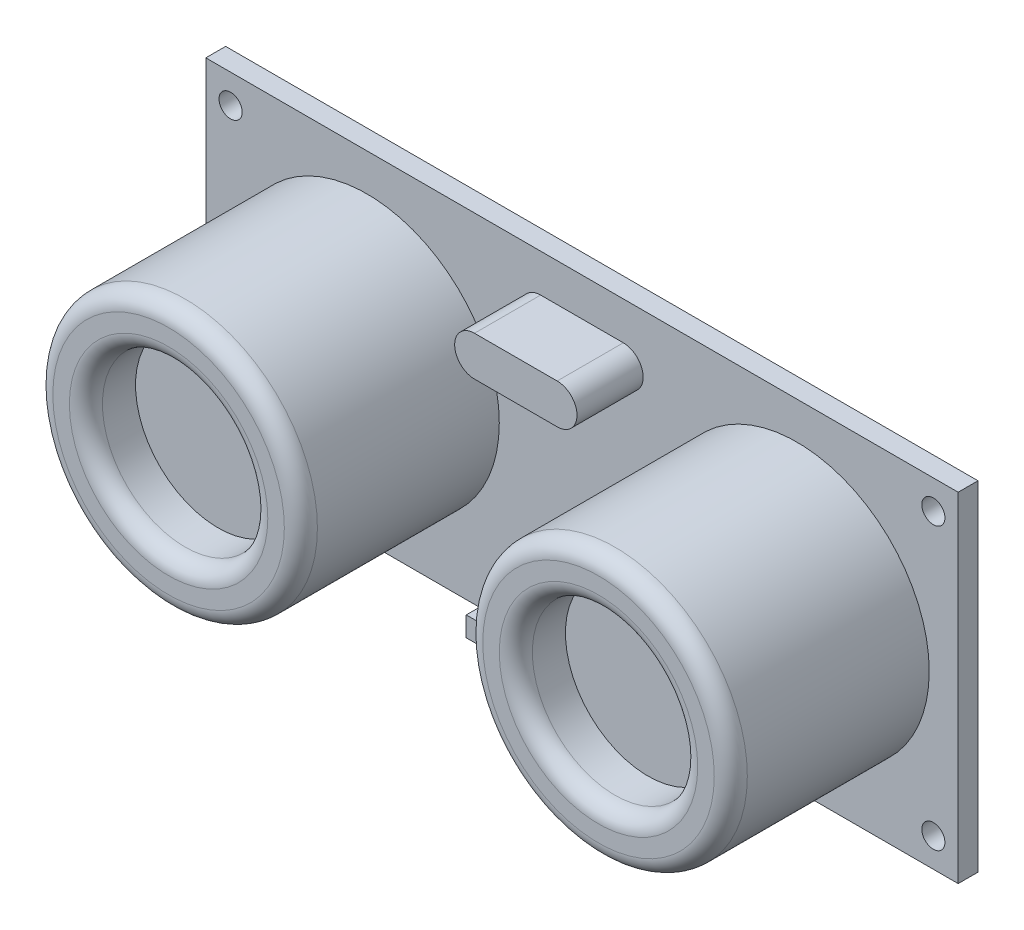
ISO-10303-21;
HEADER;
FILE_DESCRIPTION(('STEP AP214'),'2;1');
FILE_NAME('part.step','',(''),(''),'','','');
FILE_SCHEMA(('AUTOMOTIVE_DESIGN { 1 0 10303 214 1 1 1 1 }'));
ENDSEC;
DATA;
#1=APPLICATION_CONTEXT('core data for automotive mechanical design processes');
#2=APPLICATION_PROTOCOL_DEFINITION('international standard','automotive_design',2000,#1);
#3=PRODUCT_CONTEXT('',#1,'mechanical');
#4=PRODUCT('Part','Part','',(#3));
#5=PRODUCT_RELATED_PRODUCT_CATEGORY('part','',(#4));
#6=PRODUCT_DEFINITION_FORMATION('','',#4);
#7=PRODUCT_DEFINITION_CONTEXT('part definition',#1,'design');
#8=PRODUCT_DEFINITION('design','',#6,#7);
#9=PRODUCT_DEFINITION_SHAPE('','',#8);
#10=(LENGTH_UNIT() NAMED_UNIT(*) SI_UNIT(.MILLI.,.METRE.));
#11=(NAMED_UNIT(*) PLANE_ANGLE_UNIT() SI_UNIT($,.RADIAN.));
#12=(NAMED_UNIT(*) SI_UNIT($,.STERADIAN.) SOLID_ANGLE_UNIT());
#13=UNCERTAINTY_MEASURE_WITH_UNIT(LENGTH_MEASURE(1.E-05),#10,'distance_accuracy_value','');
#14=(GEOMETRIC_REPRESENTATION_CONTEXT(3) GLOBAL_UNCERTAINTY_ASSIGNED_CONTEXT((#13)) GLOBAL_UNIT_ASSIGNED_CONTEXT((#10,
#11,#12)) REPRESENTATION_CONTEXT('',''));
#15=CARTESIAN_POINT('',(0.,0.,0.));
#16=DIRECTION('',(0.,0.,1.));
#17=DIRECTION('',(1.,0.,0.));
#18=AXIS2_PLACEMENT_3D('',#15,#16,#17);
#19=CARTESIAN_POINT('',(0.,0.,1.2));
#20=DIRECTION('',(0.,0.,-1.));
#21=DIRECTION('',(-1.,0.,0.));
#22=AXIS2_PLACEMENT_3D('',#19,#20,#21);
#23=PLANE('',#22);
#24=CARTESIAN_POINT('',(-2.5,6.75,1.2));
#25=DIRECTION('',(0.,0.,1.));
#26=DIRECTION('',(1.,0.,0.));
#27=AXIS2_PLACEMENT_3D('',#24,#25,#26);
#28=CIRCLE('',#27,1.2);
#29=CARTESIAN_POINT('',(-2.5,7.95,1.2));
#30=VERTEX_POINT('',#29);
#31=CARTESIAN_POINT('',(-2.5,5.55,1.2));
#32=VERTEX_POINT('',#31);
#33=EDGE_CURVE('E147',#30,#32,#28,.T.);
#34=ORIENTED_EDGE('',*,*,#33,.F.);
#35=DIRECTION('',(-1.,0.,0.));
#36=VECTOR('',#35,1.);
#37=CARTESIAN_POINT('',(-2.5,7.95,1.2));
#38=LINE('',#37,#36);
#39=CARTESIAN_POINT('',(2.5,7.95,1.2));
#40=VERTEX_POINT('',#39);
#41=EDGE_CURVE('E160',#40,#30,#38,.T.);
#42=ORIENTED_EDGE('',*,*,#41,.F.);
#43=CARTESIAN_POINT('',(2.5,6.75,1.2));
#44=DIRECTION('',(0.,0.,1.));
#45=DIRECTION('',(1.,0.,0.));
#46=AXIS2_PLACEMENT_3D('',#43,#44,#45);
#47=CIRCLE('',#46,1.2);
#48=CARTESIAN_POINT('',(2.5,5.55,1.2));
#49=VERTEX_POINT('',#48);
#50=EDGE_CURVE('E169',#49,#40,#47,.T.);
#51=ORIENTED_EDGE('',*,*,#50,.F.);
#52=DIRECTION('',(1.,0.,0.));
#53=VECTOR('',#52,1.);
#54=CARTESIAN_POINT('',(-2.5,5.55,1.2));
#55=LINE('',#54,#53);
#56=EDGE_CURVE('E150',#32,#49,#55,.T.);
#57=ORIENTED_EDGE('',*,*,#56,.F.);
#58=EDGE_LOOP('',(#34,#42,#51,#57));
#59=FACE_BOUND('',#58,.T.);
#60=CARTESIAN_POINT('',(13.,0.,1.2));
#61=DIRECTION('',(0.,0.,-1.));
#62=DIRECTION('',(-1.,0.,0.));
#63=AXIS2_PLACEMENT_3D('',#60,#61,#62);
#64=CIRCLE('',#63,8.);
#65=CARTESIAN_POINT('',(5.,0.,1.2));
#66=VERTEX_POINT('',#65);
#67=EDGE_CURVE('E248',#66,#66,#64,.F.);
#68=ORIENTED_EDGE('',*,*,#67,.F.);
#69=EDGE_LOOP('',(#68));
#70=FACE_BOUND('',#69,.T.);
#71=CARTESIAN_POINT('',(-13.,0.,1.2));
#72=DIRECTION('',(0.,0.,-1.));
#73=DIRECTION('',(-1.,0.,0.));
#74=AXIS2_PLACEMENT_3D('',#71,#72,#73);
#75=CIRCLE('',#74,8.);
#76=CARTESIAN_POINT('',(-21.,0.,1.2));
#77=VERTEX_POINT('',#76);
#78=EDGE_CURVE('E245',#77,#77,#75,.F.);
#79=ORIENTED_EDGE('',*,*,#78,.F.);
#80=EDGE_LOOP('',(#79));
#81=FACE_BOUND('',#80,.T.);
#82=DIRECTION('',(0.,1.,0.));
#83=VECTOR('',#82,1.);
#84=CARTESIAN_POINT('',(22.75,-10.25,1.2));
#85=LINE('',#84,#83);
#86=CARTESIAN_POINT('',(22.75,-10.25,1.2));
#87=VERTEX_POINT('',#86);
#88=CARTESIAN_POINT('',(22.75,10.25,1.2));
#89=VERTEX_POINT('',#88);
#90=EDGE_CURVE('E216',#87,#89,#85,.T.);
#91=ORIENTED_EDGE('',*,*,#90,.T.);
#92=DIRECTION('',(-1.,0.,0.));
#93=VECTOR('',#92,1.);
#94=CARTESIAN_POINT('',(-22.75,10.25,1.2));
#95=LINE('',#94,#93);
#96=CARTESIAN_POINT('',(-22.75,10.25,1.2));
#97=VERTEX_POINT('',#96);
#98=EDGE_CURVE('E219',#89,#97,#95,.T.);
#99=ORIENTED_EDGE('',*,*,#98,.T.);
#100=DIRECTION('',(0.,-1.,0.));
#101=VECTOR('',#100,1.);
#102=CARTESIAN_POINT('',(-22.75,-10.25,1.2));
#103=LINE('',#102,#101);
#104=CARTESIAN_POINT('',(-22.75,-10.25,1.2));
#105=VERTEX_POINT('',#104);
#106=EDGE_CURVE('E222',#97,#105,#103,.T.);
#107=ORIENTED_EDGE('',*,*,#106,.T.);
#108=DIRECTION('',(1.,0.,0.));
#109=VECTOR('',#108,1.);
#110=CARTESIAN_POINT('',(-22.75,-10.25,1.2));
#111=LINE('',#110,#109);
#112=EDGE_CURVE('E224',#105,#87,#111,.T.);
#113=ORIENTED_EDGE('',*,*,#112,.T.);
#114=EDGE_LOOP('',(#91,#99,#107,#113));
#115=FACE_BOUND('',#114,.T.);
#116=CARTESIAN_POINT('',(21.25,8.5,1.2));
#117=DIRECTION('',(0.,0.,1.));
#118=DIRECTION('',(1.,0.,0.));
#119=AXIS2_PLACEMENT_3D('',#116,#117,#118);
#120=CIRCLE('',#119,0.699999999999998);
#121=CARTESIAN_POINT('',(21.95,8.5,1.2));
#122=VERTEX_POINT('',#121);
#123=EDGE_CURVE('E210',#122,#122,#120,.T.);
#124=ORIENTED_EDGE('',*,*,#123,.F.);
#125=EDGE_LOOP('',(#124));
#126=FACE_BOUND('',#125,.T.);
#127=CARTESIAN_POINT('',(-21.25,8.5,1.2));
#128=DIRECTION('',(0.,0.,1.));
#129=DIRECTION('',(1.,0.,0.));
#130=AXIS2_PLACEMENT_3D('',#127,#128,#129);
#131=CIRCLE('',#130,0.699999999999998);
#132=CARTESIAN_POINT('',(-20.55,8.5,1.2));
#133=VERTEX_POINT('',#132);
#134=EDGE_CURVE('E204',#133,#133,#131,.T.);
#135=ORIENTED_EDGE('',*,*,#134,.F.);
#136=EDGE_LOOP('',(#135));
#137=FACE_BOUND('',#136,.T.);
#138=CARTESIAN_POINT('',(-21.25,-8.5,1.2));
#139=DIRECTION('',(0.,0.,1.));
#140=DIRECTION('',(1.,0.,0.));
#141=AXIS2_PLACEMENT_3D('',#138,#139,#140);
#142=CIRCLE('',#141,0.699999999999998);
#143=CARTESIAN_POINT('',(-20.55,-8.5,1.2));
#144=VERTEX_POINT('',#143);
#145=EDGE_CURVE('E198',#144,#144,#142,.T.);
#146=ORIENTED_EDGE('',*,*,#145,.F.);
#147=EDGE_LOOP('',(#146));
#148=FACE_BOUND('',#147,.T.);
#149=CARTESIAN_POINT('',(21.25,-8.5,1.2));
#150=DIRECTION('',(0.,0.,1.));
#151=DIRECTION('',(1.,0.,0.));
#152=AXIS2_PLACEMENT_3D('',#149,#150,#151);
#153=CIRCLE('',#152,0.699999999999998);
#154=CARTESIAN_POINT('',(21.95,-8.5,1.2));
#155=VERTEX_POINT('',#154);
#156=EDGE_CURVE('E192',#155,#155,#153,.T.);
#157=ORIENTED_EDGE('',*,*,#156,.F.);
#158=EDGE_LOOP('',(#157));
#159=FACE_BOUND('',#158,.T.);
#160=DIRECTION('',(0.,-1.,0.));
#161=VECTOR('',#160,1.);
#162=CARTESIAN_POINT('',(-4.,-8.05,1.2));
#163=LINE('',#162,#161);
#164=CARTESIAN_POINT('',(-4.,-8.05,1.2));
#165=VERTEX_POINT('',#164);
#166=CARTESIAN_POINT('',(-4.,-9.25,1.2));
#167=VERTEX_POINT('',#166);
#168=EDGE_CURVE('E146',#165,#167,#163,.T.);
#169=ORIENTED_EDGE('',*,*,#168,.F.);
#170=DIRECTION('',(-1.,0.,0.));
#171=VECTOR('',#170,1.);
#172=CARTESIAN_POINT('',(-4.,-8.05,1.2));
#173=LINE('',#172,#171);
#174=CARTESIAN_POINT('',(4.,-8.05,1.2));
#175=VERTEX_POINT('',#174);
#176=EDGE_CURVE('E143',#175,#165,#173,.T.);
#177=ORIENTED_EDGE('',*,*,#176,.F.);
#178=DIRECTION('',(0.,1.,0.));
#179=VECTOR('',#178,1.);
#180=CARTESIAN_POINT('',(4.,-8.05,1.2));
#181=LINE('',#180,#179);
#182=CARTESIAN_POINT('',(4.,-9.25,1.2));
#183=VERTEX_POINT('',#182);
#184=EDGE_CURVE('E57',#183,#175,#181,.T.);
#185=ORIENTED_EDGE('',*,*,#184,.F.);
#186=DIRECTION('',(1.,0.,0.));
#187=VECTOR('',#186,1.);
#188=CARTESIAN_POINT('',(-4.,-9.25,1.2));
#189=LINE('',#188,#187);
#190=EDGE_CURVE('E52',#167,#183,#189,.T.);
#191=ORIENTED_EDGE('',*,*,#190,.F.);
#192=EDGE_LOOP('',(#169,#177,#185,#191));
#193=FACE_BOUND('',#192,.T.);
#194=ADVANCED_FACE('F37',(#59,#70,#81,#115,#126,#137,#148,#159,#193),#23,.F.);
#195=CARTESIAN_POINT('',(0.,0.,0.));
#196=DIRECTION('',(0.,0.,-1.));
#197=DIRECTION('',(-1.,0.,0.));
#198=AXIS2_PLACEMENT_3D('',#195,#196,#197);
#199=PLANE('',#198);
#200=CARTESIAN_POINT('',(-21.25,-8.5,0.));
#201=DIRECTION('',(0.,0.,1.));
#202=DIRECTION('',(1.,0.,0.));
#203=AXIS2_PLACEMENT_3D('',#200,#201,#202);
#204=CIRCLE('',#203,0.699999999999998);
#205=CARTESIAN_POINT('',(-20.55,-8.5,0.));
#206=VERTEX_POINT('',#205);
#207=EDGE_CURVE('E195',#206,#206,#204,.T.);
#208=ORIENTED_EDGE('',*,*,#207,.T.);
#209=EDGE_LOOP('',(#208));
#210=FACE_BOUND('',#209,.T.);
#211=CARTESIAN_POINT('',(21.25,8.5,0.));
#212=DIRECTION('',(0.,0.,1.));
#213=DIRECTION('',(1.,0.,0.));
#214=AXIS2_PLACEMENT_3D('',#211,#212,#213);
#215=CIRCLE('',#214,0.699999999999998);
#216=CARTESIAN_POINT('',(21.95,8.5,0.));
#217=VERTEX_POINT('',#216);
#218=EDGE_CURVE('E207',#217,#217,#215,.T.);
#219=ORIENTED_EDGE('',*,*,#218,.T.);
#220=EDGE_LOOP('',(#219));
#221=FACE_BOUND('',#220,.T.);
#222=DIRECTION('',(0.,1.,0.));
#223=VECTOR('',#222,1.);
#224=CARTESIAN_POINT('',(22.75,-10.25,0.));
#225=LINE('',#224,#223);
#226=CARTESIAN_POINT('',(22.75,-10.25,0.));
#227=VERTEX_POINT('',#226);
#228=CARTESIAN_POINT('',(22.75,10.25,0.));
#229=VERTEX_POINT('',#228);
#230=EDGE_CURVE('E213',#227,#229,#225,.T.);
#231=ORIENTED_EDGE('',*,*,#230,.F.);
#232=DIRECTION('',(1.,0.,0.));
#233=VECTOR('',#232,1.);
#234=CARTESIAN_POINT('',(-22.75,-10.25,0.));
#235=LINE('',#234,#233);
#236=CARTESIAN_POINT('',(-22.75,-10.25,0.));
#237=VERTEX_POINT('',#236);
#238=EDGE_CURVE('E220',#237,#227,#235,.T.);
#239=ORIENTED_EDGE('',*,*,#238,.F.);
#240=DIRECTION('',(0.,-1.,0.));
#241=VECTOR('',#240,1.);
#242=CARTESIAN_POINT('',(-22.75,-10.25,0.));
#243=LINE('',#242,#241);
#244=CARTESIAN_POINT('',(-22.75,10.25,0.));
#245=VERTEX_POINT('',#244);
#246=EDGE_CURVE('E231',#245,#237,#243,.T.);
#247=ORIENTED_EDGE('',*,*,#246,.F.);
#248=DIRECTION('',(-1.,0.,0.));
#249=VECTOR('',#248,1.);
#250=CARTESIAN_POINT('',(-22.75,10.25,0.));
#251=LINE('',#250,#249);
#252=EDGE_CURVE('E229',#229,#245,#251,.T.);
#253=ORIENTED_EDGE('',*,*,#252,.F.);
#254=EDGE_LOOP('',(#231,#239,#247,#253));
#255=FACE_BOUND('',#254,.T.);
#256=CARTESIAN_POINT('',(-21.25,8.5,0.));
#257=DIRECTION('',(0.,0.,1.));
#258=DIRECTION('',(1.,0.,0.));
#259=AXIS2_PLACEMENT_3D('',#256,#257,#258);
#260=CIRCLE('',#259,0.699999999999998);
#261=CARTESIAN_POINT('',(-20.55,8.5,0.));
#262=VERTEX_POINT('',#261);
#263=EDGE_CURVE('E201',#262,#262,#260,.T.);
#264=ORIENTED_EDGE('',*,*,#263,.T.);
#265=EDGE_LOOP('',(#264));
#266=FACE_BOUND('',#265,.T.);
#267=CARTESIAN_POINT('',(21.25,-8.5,0.));
#268=DIRECTION('',(0.,0.,1.));
#269=DIRECTION('',(1.,0.,0.));
#270=AXIS2_PLACEMENT_3D('',#267,#268,#269);
#271=CIRCLE('',#270,0.699999999999998);
#272=CARTESIAN_POINT('',(21.95,-8.5,0.));
#273=VERTEX_POINT('',#272);
#274=EDGE_CURVE('E191',#273,#273,#271,.T.);
#275=ORIENTED_EDGE('',*,*,#274,.T.);
#276=EDGE_LOOP('',(#275));
#277=FACE_BOUND('',#276,.T.);
#278=ADVANCED_FACE('F310',(#210,#221,#255,#266,#277),#199,.T.);
#279=CARTESIAN_POINT('',(22.75,-10.25,1.2));
#280=DIRECTION('',(-1.,0.,0.));
#281=DIRECTION('',(0.,0.,1.));
#282=AXIS2_PLACEMENT_3D('',#279,#280,#281);
#283=PLANE('',#282);
#284=ORIENTED_EDGE('',*,*,#230,.T.);
#285=DIRECTION('',(0.,0.,-1.));
#286=VECTOR('',#285,1.);
#287=CARTESIAN_POINT('',(22.75,10.25,1.2));
#288=LINE('',#287,#286);
#289=EDGE_CURVE('E242',#89,#229,#288,.T.);
#290=ORIENTED_EDGE('',*,*,#289,.F.);
#291=ORIENTED_EDGE('',*,*,#90,.F.);
#292=DIRECTION('',(0.,0.,-1.));
#293=VECTOR('',#292,1.);
#294=CARTESIAN_POINT('',(22.75,-10.25,1.2));
#295=LINE('',#294,#293);
#296=EDGE_CURVE('E226',#87,#227,#295,.T.);
#297=ORIENTED_EDGE('',*,*,#296,.T.);
#298=EDGE_LOOP('',(#284,#290,#291,#297));
#299=FACE_BOUND('',#298,.T.);
#300=ADVANCED_FACE('F316',(#299),#283,.F.);
#301=CARTESIAN_POINT('',(-22.75,10.25,1.2));
#302=DIRECTION('',(0.,-1.,0.));
#303=DIRECTION('',(0.,0.,-1.));
#304=AXIS2_PLACEMENT_3D('',#301,#302,#303);
#305=PLANE('',#304);
#306=ORIENTED_EDGE('',*,*,#252,.T.);
#307=DIRECTION('',(0.,0.,-1.));
#308=VECTOR('',#307,1.);
#309=CARTESIAN_POINT('',(-22.75,10.25,1.2));
#310=LINE('',#309,#308);
#311=EDGE_CURVE('E239',#97,#245,#310,.T.);
#312=ORIENTED_EDGE('',*,*,#311,.F.);
#313=ORIENTED_EDGE('',*,*,#98,.F.);
#314=ORIENTED_EDGE('',*,*,#289,.T.);
#315=EDGE_LOOP('',(#306,#312,#313,#314));
#316=FACE_BOUND('',#315,.T.);
#317=ADVANCED_FACE('F331',(#316),#305,.F.);
#318=CARTESIAN_POINT('',(-22.75,-10.25,1.2));
#319=DIRECTION('',(1.,0.,0.));
#320=DIRECTION('',(0.,0.,-1.));
#321=AXIS2_PLACEMENT_3D('',#318,#319,#320);
#322=PLANE('',#321);
#323=ORIENTED_EDGE('',*,*,#246,.T.);
#324=DIRECTION('',(0.,0.,-1.));
#325=VECTOR('',#324,1.);
#326=CARTESIAN_POINT('',(-22.75,-10.25,1.2));
#327=LINE('',#326,#325);
#328=EDGE_CURVE('E236',#105,#237,#327,.T.);
#329=ORIENTED_EDGE('',*,*,#328,.F.);
#330=ORIENTED_EDGE('',*,*,#106,.F.);
#331=ORIENTED_EDGE('',*,*,#311,.T.);
#332=EDGE_LOOP('',(#323,#329,#330,#331));
#333=FACE_BOUND('',#332,.T.);
#334=ADVANCED_FACE('F327',(#333),#322,.F.);
#335=CARTESIAN_POINT('',(-22.75,-10.25,1.2));
#336=DIRECTION('',(0.,1.,0.));
#337=DIRECTION('',(0.,0.,1.));
#338=AXIS2_PLACEMENT_3D('',#335,#336,#337);
#339=PLANE('',#338);
#340=ORIENTED_EDGE('',*,*,#238,.T.);
#341=ORIENTED_EDGE('',*,*,#296,.F.);
#342=ORIENTED_EDGE('',*,*,#112,.F.);
#343=ORIENTED_EDGE('',*,*,#328,.T.);
#344=EDGE_LOOP('',(#340,#341,#342,#343));
#345=FACE_BOUND('',#344,.T.);
#346=ADVANCED_FACE('F324',(#345),#339,.F.);
#347=CARTESIAN_POINT('',(21.25,8.5,1.2));
#348=DIRECTION('',(0.,0.,-1.));
#349=DIRECTION('',(-1.,0.,0.));
#350=AXIS2_PLACEMENT_3D('',#347,#348,#349);
#351=CYLINDRICAL_SURFACE('',#350,0.699999999999998);
#352=ORIENTED_EDGE('',*,*,#123,.T.);
#353=EDGE_LOOP('',(#352));
#354=FACE_BOUND('',#353,.T.);
#355=ORIENTED_EDGE('',*,*,#218,.F.);
#356=EDGE_LOOP('',(#355));
#357=FACE_BOUND('',#356,.T.);
#358=ADVANCED_FACE('F321',(#354,#357),#351,.F.);
#359=CARTESIAN_POINT('',(-21.25,8.5,1.2));
#360=DIRECTION('',(0.,0.,-1.));
#361=DIRECTION('',(-1.,0.,0.));
#362=AXIS2_PLACEMENT_3D('',#359,#360,#361);
#363=CYLINDRICAL_SURFACE('',#362,0.699999999999998);
#364=ORIENTED_EDGE('',*,*,#134,.T.);
#365=EDGE_LOOP('',(#364));
#366=FACE_BOUND('',#365,.T.);
#367=ORIENTED_EDGE('',*,*,#263,.F.);
#368=EDGE_LOOP('',(#367));
#369=FACE_BOUND('',#368,.T.);
#370=ADVANCED_FACE('F565',(#366,#369),#363,.F.);
#371=CARTESIAN_POINT('',(-21.25,-8.5,1.2));
#372=DIRECTION('',(0.,0.,-1.));
#373=DIRECTION('',(-1.,0.,0.));
#374=AXIS2_PLACEMENT_3D('',#371,#372,#373);
#375=CYLINDRICAL_SURFACE('',#374,0.699999999999998);
#376=ORIENTED_EDGE('',*,*,#145,.T.);
#377=EDGE_LOOP('',(#376));
#378=FACE_BOUND('',#377,.T.);
#379=ORIENTED_EDGE('',*,*,#207,.F.);
#380=EDGE_LOOP('',(#379));
#381=FACE_BOUND('',#380,.T.);
#382=ADVANCED_FACE('F556',(#378,#381),#375,.F.);
#383=CARTESIAN_POINT('',(21.25,-8.5,1.2));
#384=DIRECTION('',(0.,0.,-1.));
#385=DIRECTION('',(-1.,0.,0.));
#386=AXIS2_PLACEMENT_3D('',#383,#384,#385);
#387=CYLINDRICAL_SURFACE('',#386,0.699999999999998);
#388=ORIENTED_EDGE('',*,*,#156,.T.);
#389=EDGE_LOOP('',(#388));
#390=FACE_BOUND('',#389,.T.);
#391=ORIENTED_EDGE('',*,*,#274,.F.);
#392=EDGE_LOOP('',(#391));
#393=FACE_BOUND('',#392,.T.);
#394=ADVANCED_FACE('F455',(#390,#393),#387,.F.);
#395=CARTESIAN_POINT('',(-13.,0.,13.2));
#396=DIRECTION('',(0.,0.,-1.));
#397=DIRECTION('',(-1.,0.,0.));
#398=AXIS2_PLACEMENT_3D('',#395,#396,#397);
#399=CYLINDRICAL_SURFACE('',#398,8.);
#400=CARTESIAN_POINT('',(-13.,0.,12.2));
#401=DIRECTION('',(0.,0.,1.));
#402=DIRECTION('',(1.,0.,0.));
#403=AXIS2_PLACEMENT_3D('',#400,#401,#402);
#404=CIRCLE('',#403,8.);
#405=CARTESIAN_POINT('',(-5.,0.,12.2));
#406=VERTEX_POINT('',#405);
#407=EDGE_CURVE('E45',#406,#406,#404,.F.);
#408=ORIENTED_EDGE('',*,*,#407,.T.);
#409=EDGE_LOOP('',(#408));
#410=FACE_BOUND('',#409,.T.);
#411=ORIENTED_EDGE('',*,*,#78,.T.);
#412=EDGE_LOOP('',(#411));
#413=FACE_BOUND('',#412,.T.);
#414=ADVANCED_FACE('F271',(#410,#413),#399,.T.);
#415=CARTESIAN_POINT('',(-13.,0.,13.2));
#416=DIRECTION('',(0.,0.,1.));
#417=DIRECTION('',(1.,0.,0.));
#418=AXIS2_PLACEMENT_3D('',#415,#416,#417);
#419=PLANE('',#418);
#420=CARTESIAN_POINT('',(-13.,0.,13.2));
#421=DIRECTION('',(0.,0.,1.));
#422=DIRECTION('',(1.,0.,0.));
#423=AXIS2_PLACEMENT_3D('',#420,#421,#422);
#424=CIRCLE('',#423,7.);
#425=CARTESIAN_POINT('',(-6.,0.,13.2));
#426=VERTEX_POINT('',#425);
#427=EDGE_CURVE('E266',#426,#426,#424,.T.);
#428=ORIENTED_EDGE('',*,*,#427,.T.);
#429=EDGE_LOOP('',(#428));
#430=FACE_BOUND('',#429,.T.);
#431=CARTESIAN_POINT('',(-13.,0.,13.2));
#432=DIRECTION('',(0.,0.,1.));
#433=DIRECTION('',(1.,0.,0.));
#434=AXIS2_PLACEMENT_3D('',#431,#432,#433);
#435=CIRCLE('',#434,6.);
#436=CARTESIAN_POINT('',(-7.,0.,13.2));
#437=VERTEX_POINT('',#436);
#438=EDGE_CURVE('E263',#437,#437,#435,.F.);
#439=ORIENTED_EDGE('',*,*,#438,.T.);
#440=EDGE_LOOP('',(#439));
#441=FACE_BOUND('',#440,.T.);
#442=ADVANCED_FACE('F280',(#430,#441),#419,.T.);
#443=CARTESIAN_POINT('',(13.,0.,13.2));
#444=DIRECTION('',(0.,0.,-1.));
#445=DIRECTION('',(-1.,0.,0.));
#446=AXIS2_PLACEMENT_3D('',#443,#444,#445);
#447=CYLINDRICAL_SURFACE('',#446,8.);
#448=CARTESIAN_POINT('',(13.,0.,12.2));
#449=DIRECTION('',(0.,0.,1.));
#450=DIRECTION('',(1.,0.,0.));
#451=AXIS2_PLACEMENT_3D('',#448,#449,#450);
#452=CIRCLE('',#451,8.);
#453=CARTESIAN_POINT('',(21.,0.,12.2));
#454=VERTEX_POINT('',#453);
#455=EDGE_CURVE('E257',#454,#454,#452,.F.);
#456=ORIENTED_EDGE('',*,*,#455,.T.);
#457=EDGE_LOOP('',(#456));
#458=FACE_BOUND('',#457,.T.);
#459=ORIENTED_EDGE('',*,*,#67,.T.);
#460=EDGE_LOOP('',(#459));
#461=FACE_BOUND('',#460,.T.);
#462=ADVANCED_FACE('F283',(#458,#461),#447,.T.);
#463=CARTESIAN_POINT('',(13.,0.,13.2));
#464=DIRECTION('',(0.,0.,1.));
#465=DIRECTION('',(1.,0.,0.));
#466=AXIS2_PLACEMENT_3D('',#463,#464,#465);
#467=PLANE('',#466);
#468=CARTESIAN_POINT('',(13.,0.,13.2));
#469=DIRECTION('',(0.,0.,1.));
#470=DIRECTION('',(1.,0.,0.));
#471=AXIS2_PLACEMENT_3D('',#468,#469,#470);
#472=CIRCLE('',#471,7.);
#473=CARTESIAN_POINT('',(20.,0.,13.2));
#474=VERTEX_POINT('',#473);
#475=EDGE_CURVE('E254',#474,#474,#472,.T.);
#476=ORIENTED_EDGE('',*,*,#475,.T.);
#477=EDGE_LOOP('',(#476));
#478=FACE_BOUND('',#477,.T.);
#479=CARTESIAN_POINT('',(13.,0.,13.2));
#480=DIRECTION('',(0.,0.,1.));
#481=DIRECTION('',(1.,0.,0.));
#482=AXIS2_PLACEMENT_3D('',#479,#480,#481);
#483=CIRCLE('',#482,6.);
#484=CARTESIAN_POINT('',(19.,0.,13.2));
#485=VERTEX_POINT('',#484);
#486=EDGE_CURVE('E251',#485,#485,#483,.F.);
#487=ORIENTED_EDGE('',*,*,#486,.T.);
#488=EDGE_LOOP('',(#487));
#489=FACE_BOUND('',#488,.T.);
#490=ADVANCED_FACE('F296',(#478,#489),#467,.T.);
#491=CARTESIAN_POINT('',(-13.,0.,10.2));
#492=DIRECTION('',(0.,0.,1.));
#493=DIRECTION('',(1.,0.,0.));
#494=AXIS2_PLACEMENT_3D('',#491,#492,#493);
#495=CYLINDRICAL_SURFACE('',#494,5.);
#496=CARTESIAN_POINT('',(-13.,0.,12.2));
#497=DIRECTION('',(0.,0.,1.));
#498=DIRECTION('',(1.,0.,0.));
#499=AXIS2_PLACEMENT_3D('',#496,#497,#498);
#500=CIRCLE('',#499,5.);
#501=CARTESIAN_POINT('',(-8.,0.,12.2));
#502=VERTEX_POINT('',#501);
#503=EDGE_CURVE('E11',#502,#502,#500,.T.);
#504=ORIENTED_EDGE('',*,*,#503,.T.);
#505=EDGE_LOOP('',(#504));
#506=FACE_BOUND('',#505,.T.);
#507=CARTESIAN_POINT('',(-13.,0.,10.2));
#508=DIRECTION('',(0.,0.,1.));
#509=DIRECTION('',(1.,0.,0.));
#510=AXIS2_PLACEMENT_3D('',#507,#508,#509);
#511=CIRCLE('',#510,5.);
#512=CARTESIAN_POINT('',(-8.,0.,10.2));
#513=VERTEX_POINT('',#512);
#514=EDGE_CURVE('E188',#513,#513,#511,.T.);
#515=ORIENTED_EDGE('',*,*,#514,.F.);
#516=EDGE_LOOP('',(#515));
#517=FACE_BOUND('',#516,.T.);
#518=ADVANCED_FACE('F292',(#506,#517),#495,.F.);
#519=CARTESIAN_POINT('',(-13.,0.,10.2));
#520=DIRECTION('',(0.,0.,1.));
#521=DIRECTION('',(1.,0.,0.));
#522=AXIS2_PLACEMENT_3D('',#519,#520,#521);
#523=PLANE('',#522);
#524=ORIENTED_EDGE('',*,*,#514,.T.);
#525=EDGE_LOOP('',(#524));
#526=FACE_BOUND('',#525,.T.);
#527=ADVANCED_FACE('F295',(#526),#523,.T.);
#528=CARTESIAN_POINT('',(13.,0.,10.2));
#529=DIRECTION('',(0.,0.,1.));
#530=DIRECTION('',(1.,0.,0.));
#531=AXIS2_PLACEMENT_3D('',#528,#529,#530);
#532=CYLINDRICAL_SURFACE('',#531,5.);
#533=CARTESIAN_POINT('',(13.,0.,12.2));
#534=DIRECTION('',(0.,0.,1.));
#535=DIRECTION('',(1.,0.,0.));
#536=AXIS2_PLACEMENT_3D('',#533,#534,#535);
#537=CIRCLE('',#536,5.);
#538=CARTESIAN_POINT('',(18.,0.,12.2));
#539=VERTEX_POINT('',#538);
#540=EDGE_CURVE('E260',#539,#539,#537,.T.);
#541=ORIENTED_EDGE('',*,*,#540,.T.);
#542=EDGE_LOOP('',(#541));
#543=FACE_BOUND('',#542,.T.);
#544=CARTESIAN_POINT('',(13.,0.,10.2));
#545=DIRECTION('',(0.,0.,1.));
#546=DIRECTION('',(1.,0.,0.));
#547=AXIS2_PLACEMENT_3D('',#544,#545,#546);
#548=CIRCLE('',#547,5.);
#549=CARTESIAN_POINT('',(18.,0.,10.2));
#550=VERTEX_POINT('',#549);
#551=EDGE_CURVE('E185',#550,#550,#548,.T.);
#552=ORIENTED_EDGE('',*,*,#551,.F.);
#553=EDGE_LOOP('',(#552));
#554=FACE_BOUND('',#553,.T.);
#555=ADVANCED_FACE('F301',(#543,#554),#532,.F.);
#556=CARTESIAN_POINT('',(13.,0.,10.2));
#557=DIRECTION('',(0.,0.,1.));
#558=DIRECTION('',(1.,0.,0.));
#559=AXIS2_PLACEMENT_3D('',#556,#557,#558);
#560=PLANE('',#559);
#561=ORIENTED_EDGE('',*,*,#551,.T.);
#562=EDGE_LOOP('',(#561));
#563=FACE_BOUND('',#562,.T.);
#564=ADVANCED_FACE('F306',(#563),#560,.T.);
#565=CARTESIAN_POINT('',(13.,0.,12.2));
#566=DIRECTION('',(0.,0.,1.));
#567=DIRECTION('',(1.,0.,0.));
#568=AXIS2_PLACEMENT_3D('',#565,#566,#567);
#569=TOROIDAL_SURFACE('',#568,7.,1.);
#570=ORIENTED_EDGE('',*,*,#455,.F.);
#571=EDGE_LOOP('',(#570));
#572=FACE_BOUND('',#571,.T.);
#573=ORIENTED_EDGE('',*,*,#475,.F.);
#574=EDGE_LOOP('',(#573));
#575=FACE_BOUND('',#574,.T.);
#576=ADVANCED_FACE('F339',(#572,#575),#569,.T.);
#577=CARTESIAN_POINT('',(13.,0.,12.2));
#578=DIRECTION('',(0.,0.,1.));
#579=DIRECTION('',(1.,0.,0.));
#580=AXIS2_PLACEMENT_3D('',#577,#578,#579);
#581=TOROIDAL_SURFACE('',#580,6.,1.);
#582=ORIENTED_EDGE('',*,*,#486,.F.);
#583=EDGE_LOOP('',(#582));
#584=FACE_BOUND('',#583,.T.);
#585=ORIENTED_EDGE('',*,*,#540,.F.);
#586=EDGE_LOOP('',(#585));
#587=FACE_BOUND('',#586,.T.);
#588=ADVANCED_FACE('F277',(#584,#587),#581,.T.);
#589=CARTESIAN_POINT('',(-13.,0.,12.2));
#590=DIRECTION('',(0.,0.,1.));
#591=DIRECTION('',(1.,0.,0.));
#592=AXIS2_PLACEMENT_3D('',#589,#590,#591);
#593=TOROIDAL_SURFACE('',#592,7.,1.);
#594=ORIENTED_EDGE('',*,*,#407,.F.);
#595=EDGE_LOOP('',(#594));
#596=FACE_BOUND('',#595,.T.);
#597=ORIENTED_EDGE('',*,*,#427,.F.);
#598=EDGE_LOOP('',(#597));
#599=FACE_BOUND('',#598,.T.);
#600=ADVANCED_FACE('F274',(#596,#599),#593,.T.);
#601=CARTESIAN_POINT('',(-13.,0.,12.2));
#602=DIRECTION('',(0.,0.,1.));
#603=DIRECTION('',(1.,0.,0.));
#604=AXIS2_PLACEMENT_3D('',#601,#602,#603);
#605=TOROIDAL_SURFACE('',#604,6.,1.);
#606=ORIENTED_EDGE('',*,*,#438,.F.);
#607=EDGE_LOOP('',(#606));
#608=FACE_BOUND('',#607,.T.);
#609=ORIENTED_EDGE('',*,*,#503,.F.);
#610=EDGE_LOOP('',(#609));
#611=FACE_BOUND('',#610,.T.);
#612=ADVANCED_FACE('F39',(#608,#611),#605,.T.);
#613=CARTESIAN_POINT('',(-2.5,6.75,5.2));
#614=DIRECTION('',(0.,0.,-1.));
#615=DIRECTION('',(-1.,0.,0.));
#616=AXIS2_PLACEMENT_3D('',#613,#614,#615);
#617=CYLINDRICAL_SURFACE('',#616,1.2);
#618=ORIENTED_EDGE('',*,*,#33,.T.);
#619=DIRECTION('',(0.,0.,-1.));
#620=VECTOR('',#619,1.);
#621=CARTESIAN_POINT('',(-2.5,5.55,5.2));
#622=LINE('',#621,#620);
#623=CARTESIAN_POINT('',(-2.5,5.55,5.2));
#624=VERTEX_POINT('',#623);
#625=EDGE_CURVE('E182',#624,#32,#622,.T.);
#626=ORIENTED_EDGE('',*,*,#625,.F.);
#627=CARTESIAN_POINT('',(-2.5,6.75,5.2));
#628=DIRECTION('',(0.,0.,1.));
#629=DIRECTION('',(1.,0.,0.));
#630=AXIS2_PLACEMENT_3D('',#627,#628,#629);
#631=CIRCLE('',#630,1.2);
#632=CARTESIAN_POINT('',(-2.5,7.95,5.2));
#633=VERTEX_POINT('',#632);
#634=EDGE_CURVE('E156',#633,#624,#631,.T.);
#635=ORIENTED_EDGE('',*,*,#634,.F.);
#636=DIRECTION('',(0.,0.,-1.));
#637=VECTOR('',#636,1.);
#638=CARTESIAN_POINT('',(-2.5,7.95,5.2));
#639=LINE('',#638,#637);
#640=EDGE_CURVE('E165',#633,#30,#639,.T.);
#641=ORIENTED_EDGE('',*,*,#640,.T.);
#642=EDGE_LOOP('',(#618,#626,#635,#641));
#643=FACE_BOUND('',#642,.T.);
#644=ADVANCED_FACE('F289',(#643),#617,.T.);
#645=CARTESIAN_POINT('',(-2.5,5.55,5.2));
#646=DIRECTION('',(0.,1.,0.));
#647=DIRECTION('',(0.,0.,1.));
#648=AXIS2_PLACEMENT_3D('',#645,#646,#647);
#649=PLANE('',#648);
#650=ORIENTED_EDGE('',*,*,#56,.T.);
#651=DIRECTION('',(0.,0.,-1.));
#652=VECTOR('',#651,1.);
#653=CARTESIAN_POINT('',(2.5,5.55,5.2));
#654=LINE('',#653,#652);
#655=CARTESIAN_POINT('',(2.5,5.55,5.2));
#656=VERTEX_POINT('',#655);
#657=EDGE_CURVE('E179',#656,#49,#654,.T.);
#658=ORIENTED_EDGE('',*,*,#657,.F.);
#659=DIRECTION('',(1.,0.,0.));
#660=VECTOR('',#659,1.);
#661=CARTESIAN_POINT('',(-2.5,5.55,5.2));
#662=LINE('',#661,#660);
#663=EDGE_CURVE('E159',#624,#656,#662,.T.);
#664=ORIENTED_EDGE('',*,*,#663,.F.);
#665=ORIENTED_EDGE('',*,*,#625,.T.);
#666=EDGE_LOOP('',(#650,#658,#664,#665));
#667=FACE_BOUND('',#666,.T.);
#668=ADVANCED_FACE('F360',(#667),#649,.F.);
#669=CARTESIAN_POINT('',(2.5,6.75,5.2));
#670=DIRECTION('',(0.,0.,-1.));
#671=DIRECTION('',(-1.,0.,0.));
#672=AXIS2_PLACEMENT_3D('',#669,#670,#671);
#673=CYLINDRICAL_SURFACE('',#672,1.2);
#674=ORIENTED_EDGE('',*,*,#50,.T.);
#675=DIRECTION('',(0.,0.,-1.));
#676=VECTOR('',#675,1.);
#677=CARTESIAN_POINT('',(2.5,7.95,5.2));
#678=LINE('',#677,#676);
#679=CARTESIAN_POINT('',(2.5,7.95,5.2));
#680=VERTEX_POINT('',#679);
#681=EDGE_CURVE('E176',#680,#40,#678,.T.);
#682=ORIENTED_EDGE('',*,*,#681,.F.);
#683=CARTESIAN_POINT('',(2.5,6.75,5.2));
#684=DIRECTION('',(0.,0.,1.));
#685=DIRECTION('',(1.,0.,0.));
#686=AXIS2_PLACEMENT_3D('',#683,#684,#685);
#687=CIRCLE('',#686,1.2);
#688=EDGE_CURVE('E162',#656,#680,#687,.T.);
#689=ORIENTED_EDGE('',*,*,#688,.F.);
#690=ORIENTED_EDGE('',*,*,#657,.T.);
#691=EDGE_LOOP('',(#674,#682,#689,#690));
#692=FACE_BOUND('',#691,.T.);
#693=ADVANCED_FACE('F364',(#692),#673,.T.);
#694=CARTESIAN_POINT('',(-2.5,7.95,5.2));
#695=DIRECTION('',(0.,-1.,0.));
#696=DIRECTION('',(0.,0.,-1.));
#697=AXIS2_PLACEMENT_3D('',#694,#695,#696);
#698=PLANE('',#697);
#699=ORIENTED_EDGE('',*,*,#41,.T.);
#700=ORIENTED_EDGE('',*,*,#640,.F.);
#701=DIRECTION('',(-1.,0.,0.));
#702=VECTOR('',#701,1.);
#703=CARTESIAN_POINT('',(-2.5,7.95,5.2));
#704=LINE('',#703,#702);
#705=EDGE_CURVE('E164',#680,#633,#704,.T.);
#706=ORIENTED_EDGE('',*,*,#705,.F.);
#707=ORIENTED_EDGE('',*,*,#681,.T.);
#708=EDGE_LOOP('',(#699,#700,#706,#707));
#709=FACE_BOUND('',#708,.T.);
#710=ADVANCED_FACE('F368',(#709),#698,.F.);
#711=CARTESIAN_POINT('',(-2.5,6.75,5.2));
#712=DIRECTION('',(0.,0.,1.));
#713=DIRECTION('',(1.,0.,0.));
#714=AXIS2_PLACEMENT_3D('',#711,#712,#713);
#715=PLANE('',#714);
#716=ORIENTED_EDGE('',*,*,#634,.T.);
#717=ORIENTED_EDGE('',*,*,#663,.T.);
#718=ORIENTED_EDGE('',*,*,#688,.T.);
#719=ORIENTED_EDGE('',*,*,#705,.T.);
#720=EDGE_LOOP('',(#716,#717,#718,#719));
#721=FACE_BOUND('',#720,.T.);
#722=ADVANCED_FACE('F372',(#721),#715,.T.);
#723=CARTESIAN_POINT('',(-4.,-8.05,4.2));
#724=DIRECTION('',(1.,0.,0.));
#725=DIRECTION('',(0.,0.,-1.));
#726=AXIS2_PLACEMENT_3D('',#723,#724,#725);
#727=PLANE('',#726);
#728=ORIENTED_EDGE('',*,*,#168,.T.);
#729=DIRECTION('',(0.,0.,-1.));
#730=VECTOR('',#729,1.);
#731=CARTESIAN_POINT('',(-4.,-9.25,4.2));
#732=LINE('',#731,#730);
#733=CARTESIAN_POINT('',(-4.,-9.25,4.2));
#734=VERTEX_POINT('',#733);
#735=EDGE_CURVE('E127',#734,#167,#732,.T.);
#736=ORIENTED_EDGE('',*,*,#735,.F.);
#737=DIRECTION('',(0.,-1.,0.));
#738=VECTOR('',#737,1.);
#739=CARTESIAN_POINT('',(-4.,-8.05,4.2));
#740=LINE('',#739,#738);
#741=CARTESIAN_POINT('',(-4.,-8.05,4.2));
#742=VERTEX_POINT('',#741);
#743=EDGE_CURVE('E134',#742,#734,#740,.T.);
#744=ORIENTED_EDGE('',*,*,#743,.F.);
#745=DIRECTION('',(0.,0.,-1.));
#746=VECTOR('',#745,1.);
#747=CARTESIAN_POINT('',(-4.,-8.05,4.2));
#748=LINE('',#747,#746);
#749=EDGE_CURVE('E663',#742,#165,#748,.T.);
#750=ORIENTED_EDGE('',*,*,#749,.T.);
#751=EDGE_LOOP('',(#728,#736,#744,#750));
#752=FACE_BOUND('',#751,.T.);
#753=ADVANCED_FACE('F145',(#752),#727,.F.);
#754=CARTESIAN_POINT('',(-4.,-9.25,4.2));
#755=DIRECTION('',(0.,1.,0.));
#756=DIRECTION('',(0.,0.,1.));
#757=AXIS2_PLACEMENT_3D('',#754,#755,#756);
#758=PLANE('',#757);
#759=ORIENTED_EDGE('',*,*,#190,.T.);
#760=DIRECTION('',(0.,0.,-1.));
#761=VECTOR('',#760,1.);
#762=CARTESIAN_POINT('',(4.,-9.25,4.2));
#763=LINE('',#762,#761);
#764=CARTESIAN_POINT('',(4.,-9.25,4.2));
#765=VERTEX_POINT('',#764);
#766=EDGE_CURVE('E130',#765,#183,#763,.T.);
#767=ORIENTED_EDGE('',*,*,#766,.F.);
#768=DIRECTION('',(1.,0.,0.));
#769=VECTOR('',#768,1.);
#770=CARTESIAN_POINT('',(-4.,-9.25,4.2));
#771=LINE('',#770,#769);
#772=EDGE_CURVE('E123',#734,#765,#771,.T.);
#773=ORIENTED_EDGE('',*,*,#772,.F.);
#774=ORIENTED_EDGE('',*,*,#735,.T.);
#775=EDGE_LOOP('',(#759,#767,#773,#774));
#776=FACE_BOUND('',#775,.T.);
#777=ADVANCED_FACE('F125',(#776),#758,.F.);
#778=CARTESIAN_POINT('',(4.,-8.05,4.2));
#779=DIRECTION('',(-1.,0.,0.));
#780=DIRECTION('',(0.,0.,1.));
#781=AXIS2_PLACEMENT_3D('',#778,#779,#780);
#782=PLANE('',#781);
#783=ORIENTED_EDGE('',*,*,#184,.T.);
#784=DIRECTION('',(0.,0.,-1.));
#785=VECTOR('',#784,1.);
#786=CARTESIAN_POINT('',(4.,-8.05,4.2));
#787=LINE('',#786,#785);
#788=CARTESIAN_POINT('',(4.,-8.05,4.2));
#789=VERTEX_POINT('',#788);
#790=EDGE_CURVE('E152',#789,#175,#787,.T.);
#791=ORIENTED_EDGE('',*,*,#790,.F.);
#792=DIRECTION('',(0.,1.,0.));
#793=VECTOR('',#792,1.);
#794=CARTESIAN_POINT('',(4.,-8.05,4.2));
#795=LINE('',#794,#793);
#796=EDGE_CURVE('E133',#765,#789,#795,.T.);
#797=ORIENTED_EDGE('',*,*,#796,.F.);
#798=ORIENTED_EDGE('',*,*,#766,.T.);
#799=EDGE_LOOP('',(#783,#791,#797,#798));
#800=FACE_BOUND('',#799,.T.);
#801=ADVANCED_FACE('F381',(#800),#782,.F.);
#802=CARTESIAN_POINT('',(-4.,-8.05,4.2));
#803=DIRECTION('',(0.,-1.,0.));
#804=DIRECTION('',(0.,0.,-1.));
#805=AXIS2_PLACEMENT_3D('',#802,#803,#804);
#806=PLANE('',#805);
#807=ORIENTED_EDGE('',*,*,#176,.T.);
#808=ORIENTED_EDGE('',*,*,#749,.F.);
#809=DIRECTION('',(-1.,0.,0.));
#810=VECTOR('',#809,1.);
#811=CARTESIAN_POINT('',(-4.,-8.05,4.2));
#812=LINE('',#811,#810);
#813=EDGE_CURVE('E139',#789,#742,#812,.T.);
#814=ORIENTED_EDGE('',*,*,#813,.F.);
#815=ORIENTED_EDGE('',*,*,#790,.T.);
#816=EDGE_LOOP('',(#807,#808,#814,#815));
#817=FACE_BOUND('',#816,.T.);
#818=ADVANCED_FACE('F384',(#817),#806,.F.);
#819=CARTESIAN_POINT('',(0.,0.,4.2));
#820=DIRECTION('',(0.,0.,1.));
#821=DIRECTION('',(1.,0.,0.));
#822=AXIS2_PLACEMENT_3D('',#819,#820,#821);
#823=PLANE('',#822);
#824=ORIENTED_EDGE('',*,*,#743,.T.);
#825=ORIENTED_EDGE('',*,*,#772,.T.);
#826=ORIENTED_EDGE('',*,*,#796,.T.);
#827=ORIENTED_EDGE('',*,*,#813,.T.);
#828=EDGE_LOOP('',(#824,#825,#826,#827));
#829=FACE_BOUND('',#828,.T.);
#830=ADVANCED_FACE('F137',(#829),#823,.T.);
#831=CLOSED_SHELL('',(#194,#278,#300,#317,#334,#346,#358,#370,#382,#394,#414,#442,#462,#490,
#518,#527,#555,#564,#576,#588,#600,#612,#644,#668,#693,#710,#722,#753,#777,#801,#818,#830));
#832=MANIFOLD_SOLID_BREP('B2',#831);
#833=ADVANCED_BREP_SHAPE_REPRESENTATION('',(#18,#832),#14);
#834=SHAPE_DEFINITION_REPRESENTATION(#9,#833);
ENDSEC;
END-ISO-10303-21;
